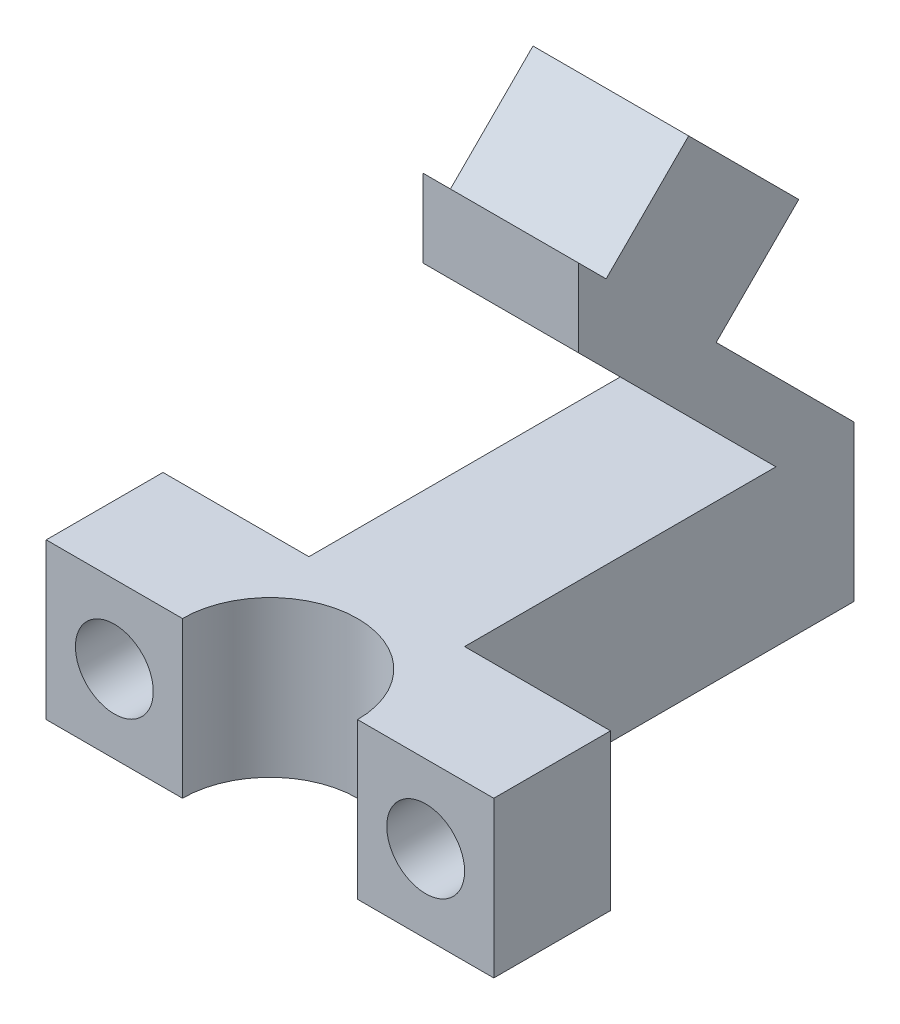
ISO-10303-21;
HEADER;
FILE_DESCRIPTION(('STEP AP214'),'2;1');
FILE_NAME('part.step','',(''),(''),'','','');
FILE_SCHEMA(('AUTOMOTIVE_DESIGN { 1 0 10303 214 1 1 1 1 }'));
ENDSEC;
DATA;
#1=APPLICATION_CONTEXT('core data for automotive mechanical design processes');
#2=APPLICATION_PROTOCOL_DEFINITION('international standard','automotive_design',2000,#1);
#3=PRODUCT_CONTEXT('',#1,'mechanical');
#4=PRODUCT('Part','Part','',(#3));
#5=PRODUCT_RELATED_PRODUCT_CATEGORY('part','',(#4));
#6=PRODUCT_DEFINITION_FORMATION('','',#4);
#7=PRODUCT_DEFINITION_CONTEXT('part definition',#1,'design');
#8=PRODUCT_DEFINITION('design','',#6,#7);
#9=PRODUCT_DEFINITION_SHAPE('','',#8);
#10=(LENGTH_UNIT() NAMED_UNIT(*) SI_UNIT(.MILLI.,.METRE.));
#11=(NAMED_UNIT(*) PLANE_ANGLE_UNIT() SI_UNIT($,.RADIAN.));
#12=(NAMED_UNIT(*) SI_UNIT($,.STERADIAN.) SOLID_ANGLE_UNIT());
#13=UNCERTAINTY_MEASURE_WITH_UNIT(LENGTH_MEASURE(1.E-05),#10,'distance_accuracy_value','');
#14=(GEOMETRIC_REPRESENTATION_CONTEXT(3) GLOBAL_UNCERTAINTY_ASSIGNED_CONTEXT((#13)) GLOBAL_UNIT_ASSIGNED_CONTEXT((#10,
#11,#12)) REPRESENTATION_CONTEXT('',''));
#15=CARTESIAN_POINT('',(0.,0.,0.));
#16=DIRECTION('',(0.,0.,1.));
#17=DIRECTION('',(1.,0.,0.));
#18=AXIS2_PLACEMENT_3D('',#15,#16,#17);
#19=CARTESIAN_POINT('',(-82.1296296296296,43.5052910052911,-100.));
#20=DIRECTION('',(0.,-0.707106781186551,0.707106781186544));
#21=DIRECTION('',(0.,-0.707106781186544,-0.707106781186551));
#22=AXIS2_PLACEMENT_3D('',#19,#20,#21);
#23=PLANE('',#22);
#24=DIRECTION('',(-1.,0.,0.));
#25=VECTOR('',#24,1.);
#26=CARTESIAN_POINT('',(17.8703703703704,78.8606300646182,-64.6446609406725));
#27=LINE('',#26,#25);
#28=CARTESIAN_POINT('',(17.8703703703704,78.8606300646182,-64.6446609406724));
#29=VERTEX_POINT('',#28);
#30=CARTESIAN_POINT('',(-22.1296296296296,78.8606300646182,-64.6446609406725));
#31=VERTEX_POINT('',#30);
#32=EDGE_CURVE('E320',#29,#31,#27,.T.);
#33=ORIENTED_EDGE('',*,*,#32,.F.);
#34=DIRECTION('',(0.,-0.707106781186544,-0.707106781186551));
#35=VECTOR('',#34,1.);
#36=CARTESIAN_POINT('',(17.8703703703704,43.505291005291,-100.));
#37=LINE('',#36,#35);
#38=CARTESIAN_POINT('',(17.8703703703704,43.505291005291,-100.));
#39=VERTEX_POINT('',#38);
#40=EDGE_CURVE('E182',#29,#39,#37,.T.);
#41=ORIENTED_EDGE('',*,*,#40,.T.);
#42=DIRECTION('',(1.,0.,0.));
#43=VECTOR('',#42,1.);
#44=CARTESIAN_POINT('',(-82.1296296296296,43.5052910052911,-100.));
#45=LINE('',#44,#43);
#46=CARTESIAN_POINT('',(-22.1296296296296,43.505291005291,-100.));
#47=VERTEX_POINT('',#46);
#48=EDGE_CURVE('E200',#47,#39,#45,.T.);
#49=ORIENTED_EDGE('',*,*,#48,.F.);
#50=DIRECTION('',(0.,-0.707106781186544,-0.707106781186551));
#51=VECTOR('',#50,1.);
#52=CARTESIAN_POINT('',(-22.1296296296296,43.505291005291,-100.));
#53=LINE('',#52,#51);
#54=EDGE_CURVE('E55',#31,#47,#53,.T.);
#55=ORIENTED_EDGE('',*,*,#54,.F.);
#56=EDGE_LOOP('',(#33,#41,#49,#55));
#57=FACE_BOUND('',#56,.T.);
#58=ADVANCED_FACE('F40',(#57),#23,.F.);
#59=DIRECTION('',(1.,0.,0.));
#60=VECTOR('',#59,1.);
#61=CARTESIAN_POINT('',(17.8703703703704,107.14490131208,-36.3603896932104));
#62=LINE('',#61,#60);
#63=CARTESIAN_POINT('',(-22.1296296296296,107.14490131208,-36.3603896932104));
#64=VERTEX_POINT('',#63);
#65=CARTESIAN_POINT('',(17.8703703703704,107.14490131208,-36.3603896932104));
#66=VERTEX_POINT('',#65);
#67=EDGE_CURVE('E63',#64,#66,#62,.T.);
#68=ORIENTED_EDGE('',*,*,#67,.F.);
#69=CARTESIAN_POINT('',(-22.1296296296296,114.215969123945,-29.2893218813449));
#70=VERTEX_POINT('',#69);
#71=EDGE_CURVE('E211',#70,#64,#53,.T.);
#72=ORIENTED_EDGE('',*,*,#71,.F.);
#73=DIRECTION('',(1.,0.,0.));
#74=VECTOR('',#73,1.);
#75=CARTESIAN_POINT('',(-82.1296296296296,114.215969123945,-29.2893218813449));
#76=LINE('',#75,#74);
#77=CARTESIAN_POINT('',(17.8703703703704,114.215969123945,-29.2893218813449));
#78=VERTEX_POINT('',#77);
#79=EDGE_CURVE('E204',#70,#78,#76,.T.);
#80=ORIENTED_EDGE('',*,*,#79,.T.);
#81=EDGE_CURVE('E197',#78,#66,#37,.T.);
#82=ORIENTED_EDGE('',*,*,#81,.T.);
#83=EDGE_LOOP('',(#68,#72,#80,#82));
#84=FACE_BOUND('',#83,.T.);
#85=ADVANCED_FACE('F311',(#84),#23,.F.);
#86=CARTESIAN_POINT('',(-59.6296296296296,43.505291005291,60.));
#87=DIRECTION('',(0.,-1.,0.));
#88=DIRECTION('',(0.,0.,-1.));
#89=AXIS2_PLACEMENT_3D('',#86,#87,#88);
#90=PLANE('',#89);
#91=DIRECTION('',(-1.,0.,0.));
#92=VECTOR('',#91,1.);
#93=CARTESIAN_POINT('',(-59.6296296296296,43.505291005291,0.));
#94=LINE('',#93,#92);
#95=CARTESIAN_POINT('',(55.3703703703704,43.505291005291,0.));
#96=VERTEX_POINT('',#95);
#97=CARTESIAN_POINT('',(17.8703703703704,43.505291005291,0.));
#98=VERTEX_POINT('',#97);
#99=EDGE_CURVE('E281',#96,#98,#94,.T.);
#100=ORIENTED_EDGE('',*,*,#99,.T.);
#101=DIRECTION('',(0.,0.,-1.));
#102=VECTOR('',#101,1.);
#103=CARTESIAN_POINT('',(17.8703703703704,43.505291005291,-79.9999999999998));
#104=LINE('',#103,#102);
#105=CARTESIAN_POINT('',(17.8703703703704,43.505291005291,-79.9999999999998));
#106=VERTEX_POINT('',#105);
#107=EDGE_CURVE('E183',#98,#106,#104,.T.);
#108=ORIENTED_EDGE('',*,*,#107,.T.);
#109=DIRECTION('',(1.,0.,0.));
#110=VECTOR('',#109,1.);
#111=CARTESIAN_POINT('',(-82.1296296296296,43.5052910052911,-79.9999999999998));
#112=LINE('',#111,#110);
#113=CARTESIAN_POINT('',(-22.1296296296296,43.505291005291,-79.9999999999998));
#114=VERTEX_POINT('',#113);
#115=EDGE_CURVE('E199',#114,#106,#112,.T.);
#116=ORIENTED_EDGE('',*,*,#115,.F.);
#117=DIRECTION('',(0.,0.,-1.));
#118=VECTOR('',#117,1.);
#119=CARTESIAN_POINT('',(-22.1296296296296,43.505291005291,-100.));
#120=LINE('',#119,#118);
#121=CARTESIAN_POINT('',(-22.1296296296296,43.505291005291,0.));
#122=VERTEX_POINT('',#121);
#123=EDGE_CURVE('E203',#122,#114,#120,.T.);
#124=ORIENTED_EDGE('',*,*,#123,.F.);
#125=CARTESIAN_POINT('',(-59.6296296296296,43.505291005291,0.));
#126=VERTEX_POINT('',#125);
#127=EDGE_CURVE('E280',#122,#126,#94,.T.);
#128=ORIENTED_EDGE('',*,*,#127,.T.);
#129=DIRECTION('',(0.,0.,-1.));
#130=VECTOR('',#129,1.);
#131=CARTESIAN_POINT('',(-59.6296296296296,43.505291005291,60.));
#132=LINE('',#131,#130);
#133=CARTESIAN_POINT('',(-59.6296296296296,43.505291005291,30.));
#134=VERTEX_POINT('',#133);
#135=EDGE_CURVE('E284',#134,#126,#132,.T.);
#136=ORIENTED_EDGE('',*,*,#135,.F.);
#137=DIRECTION('',(-1.,0.,0.));
#138=VECTOR('',#137,1.);
#139=CARTESIAN_POINT('',(-59.6296296296296,43.505291005291,30.));
#140=LINE('',#139,#138);
#141=CARTESIAN_POINT('',(-24.6296296296296,43.505291005291,30.));
#142=VERTEX_POINT('',#141);
#143=EDGE_CURVE('E250',#142,#134,#140,.T.);
#144=ORIENTED_EDGE('',*,*,#143,.F.);
#145=CARTESIAN_POINT('',(-2.12962962962962,43.505291005291,30.));
#146=DIRECTION('',(0.,1.,0.));
#147=DIRECTION('',(0.,0.,1.));
#148=AXIS2_PLACEMENT_3D('',#145,#146,#147);
#149=CIRCLE('',#148,22.5);
#150=CARTESIAN_POINT('',(20.3703703703704,43.505291005291,30.));
#151=VERTEX_POINT('',#150);
#152=EDGE_CURVE('E247',#151,#142,#149,.T.);
#153=ORIENTED_EDGE('',*,*,#152,.F.);
#154=DIRECTION('',(-1.,0.,0.));
#155=VECTOR('',#154,1.);
#156=CARTESIAN_POINT('',(20.3703703703704,43.505291005291,30.));
#157=LINE('',#156,#155);
#158=CARTESIAN_POINT('',(55.3703703703704,43.505291005291,30.));
#159=VERTEX_POINT('',#158);
#160=EDGE_CURVE('E244',#159,#151,#157,.T.);
#161=ORIENTED_EDGE('',*,*,#160,.F.);
#162=DIRECTION('',(0.,0.,-1.));
#163=VECTOR('',#162,1.);
#164=CARTESIAN_POINT('',(55.3703703703704,43.505291005291,60.));
#165=LINE('',#164,#163);
#166=EDGE_CURVE('E287',#159,#96,#165,.T.);
#167=ORIENTED_EDGE('',*,*,#166,.T.);
#168=EDGE_LOOP('',(#100,#108,#116,#124,#128,#136,#144,#153,#161,#167));
#169=FACE_BOUND('',#168,.T.);
#170=ADVANCED_FACE('F301',(#169),#90,.F.);
#171=CARTESIAN_POINT('',(0.,0.,0.));
#172=DIRECTION('',(0.,0.,1.));
#173=DIRECTION('',(1.,0.,0.));
#174=AXIS2_PLACEMENT_3D('',#171,#172,#173);
#175=PLANE('',#174);
#176=CARTESIAN_POINT('',(37.8703703703704,23.505291005291,0.));
#177=DIRECTION('',(0.,0.,1.));
#178=DIRECTION('',(1.,0.,0.));
#179=AXIS2_PLACEMENT_3D('',#176,#177,#178);
#180=CIRCLE('',#179,10.);
#181=CARTESIAN_POINT('',(47.8703703703704,23.505291005291,0.));
#182=VERTEX_POINT('',#181);
#183=EDGE_CURVE('E236',#182,#182,#180,.T.);
#184=ORIENTED_EDGE('',*,*,#183,.T.);
#185=EDGE_LOOP('',(#184));
#186=FACE_BOUND('',#185,.T.);
#187=DIRECTION('',(0.,-1.,0.));
#188=VECTOR('',#187,1.);
#189=CARTESIAN_POINT('',(17.8703703703704,43.505291005291,0.));
#190=LINE('',#189,#188);
#191=CARTESIAN_POINT('',(17.8703703703704,3.50529100529105,0.));
#192=VERTEX_POINT('',#191);
#193=EDGE_CURVE('E213',#98,#192,#190,.T.);
#194=ORIENTED_EDGE('',*,*,#193,.F.);
#195=ORIENTED_EDGE('',*,*,#99,.F.);
#196=DIRECTION('',(0.,1.,0.));
#197=VECTOR('',#196,1.);
#198=CARTESIAN_POINT('',(55.3703703703704,43.505291005291,0.));
#199=LINE('',#198,#197);
#200=CARTESIAN_POINT('',(55.3703703703704,3.50529100529105,0.));
#201=VERTEX_POINT('',#200);
#202=EDGE_CURVE('E277',#201,#96,#199,.T.);
#203=ORIENTED_EDGE('',*,*,#202,.F.);
#204=DIRECTION('',(1.,0.,0.));
#205=VECTOR('',#204,1.);
#206=CARTESIAN_POINT('',(-59.6296296296296,3.50529100529105,0.));
#207=LINE('',#206,#205);
#208=EDGE_CURVE('E273',#192,#201,#207,.T.);
#209=ORIENTED_EDGE('',*,*,#208,.F.);
#210=EDGE_LOOP('',(#194,#195,#203,#209));
#211=FACE_BOUND('',#210,.T.);
#212=ADVANCED_FACE('F356',(#186,#211),#175,.F.);
#213=CARTESIAN_POINT('',(-42.1296296296296,23.505291005291,0.));
#214=DIRECTION('',(0.,0.,1.));
#215=DIRECTION('',(1.,0.,0.));
#216=AXIS2_PLACEMENT_3D('',#213,#214,#215);
#217=CIRCLE('',#216,10.);
#218=CARTESIAN_POINT('',(-32.1296296296296,23.505291005291,0.));
#219=VERTEX_POINT('',#218);
#220=EDGE_CURVE('E241',#219,#219,#217,.T.);
#221=ORIENTED_EDGE('',*,*,#220,.T.);
#222=EDGE_LOOP('',(#221));
#223=FACE_BOUND('',#222,.T.);
#224=DIRECTION('',(0.,1.,0.));
#225=VECTOR('',#224,1.);
#226=CARTESIAN_POINT('',(-22.1296296296296,43.505291005291,0.));
#227=LINE('',#226,#225);
#228=CARTESIAN_POINT('',(-22.1296296296296,3.50529100529105,0.));
#229=VERTEX_POINT('',#228);
#230=EDGE_CURVE('E217',#229,#122,#227,.T.);
#231=ORIENTED_EDGE('',*,*,#230,.F.);
#232=CARTESIAN_POINT('',(-59.6296296296296,3.50529100529105,0.));
#233=VERTEX_POINT('',#232);
#234=EDGE_CURVE('E274',#233,#229,#207,.T.);
#235=ORIENTED_EDGE('',*,*,#234,.F.);
#236=DIRECTION('',(0.,-1.,0.));
#237=VECTOR('',#236,1.);
#238=CARTESIAN_POINT('',(-59.6296296296296,43.505291005291,0.));
#239=LINE('',#238,#237);
#240=EDGE_CURVE('E270',#126,#233,#239,.T.);
#241=ORIENTED_EDGE('',*,*,#240,.F.);
#242=ORIENTED_EDGE('',*,*,#127,.F.);
#243=EDGE_LOOP('',(#231,#235,#241,#242));
#244=FACE_BOUND('',#243,.T.);
#245=ADVANCED_FACE('F333',(#223,#244),#175,.F.);
#246=CARTESIAN_POINT('',(-59.6296296296296,43.505291005291,60.));
#247=DIRECTION('',(1.,0.,0.));
#248=DIRECTION('',(0.,0.,-1.));
#249=AXIS2_PLACEMENT_3D('',#246,#247,#248);
#250=PLANE('',#249);
#251=DIRECTION('',(0.,0.,-1.));
#252=VECTOR('',#251,1.);
#253=CARTESIAN_POINT('',(-59.6296296296296,3.50529100529105,60.));
#254=LINE('',#253,#252);
#255=CARTESIAN_POINT('',(-59.6296296296296,3.50529100529105,30.));
#256=VERTEX_POINT('',#255);
#257=EDGE_CURVE('E292',#256,#233,#254,.T.);
#258=ORIENTED_EDGE('',*,*,#257,.F.);
#259=DIRECTION('',(0.,1.,0.));
#260=VECTOR('',#259,1.);
#261=CARTESIAN_POINT('',(-59.6296296296296,-16.494708994709,30.));
#262=LINE('',#261,#260);
#263=EDGE_CURVE('E253',#256,#134,#262,.T.);
#264=ORIENTED_EDGE('',*,*,#263,.T.);
#265=ORIENTED_EDGE('',*,*,#135,.T.);
#266=ORIENTED_EDGE('',*,*,#240,.T.);
#267=EDGE_LOOP('',(#258,#264,#265,#266));
#268=FACE_BOUND('',#267,.T.);
#269=ADVANCED_FACE('F42',(#268),#250,.F.);
#270=CARTESIAN_POINT('',(-59.6296296296296,3.50529100529105,60.));
#271=DIRECTION('',(0.,1.,0.));
#272=DIRECTION('',(0.,0.,1.));
#273=AXIS2_PLACEMENT_3D('',#270,#271,#272);
#274=PLANE('',#273);
#275=CARTESIAN_POINT('',(-2.12962962962962,3.50529100529105,30.));
#276=DIRECTION('',(0.,1.,0.));
#277=DIRECTION('',(0.,0.,1.));
#278=AXIS2_PLACEMENT_3D('',#275,#276,#277);
#279=CIRCLE('',#278,22.5);
#280=CARTESIAN_POINT('',(20.3703703703704,3.50529100529105,30.));
#281=VERTEX_POINT('',#280);
#282=CARTESIAN_POINT('',(-24.6296296296296,3.50529100529105,30.));
#283=VERTEX_POINT('',#282);
#284=EDGE_CURVE('E264',#281,#283,#279,.T.);
#285=ORIENTED_EDGE('',*,*,#284,.T.);
#286=DIRECTION('',(-1.,0.,0.));
#287=VECTOR('',#286,1.);
#288=CARTESIAN_POINT('',(-59.6296296296296,3.50529100529105,30.));
#289=LINE('',#288,#287);
#290=EDGE_CURVE('E267',#283,#256,#289,.T.);
#291=ORIENTED_EDGE('',*,*,#290,.T.);
#292=ORIENTED_EDGE('',*,*,#257,.T.);
#293=ORIENTED_EDGE('',*,*,#234,.T.);
#294=DIRECTION('',(0.,0.,1.));
#295=VECTOR('',#294,1.);
#296=CARTESIAN_POINT('',(-22.1296296296296,3.50529100529105,-100.));
#297=LINE('',#296,#295);
#298=CARTESIAN_POINT('',(-22.1296296296296,3.50529100529105,-100.));
#299=VERTEX_POINT('',#298);
#300=EDGE_CURVE('E222',#299,#229,#297,.T.);
#301=ORIENTED_EDGE('',*,*,#300,.F.);
#302=DIRECTION('',(-1.,0.,0.));
#303=VECTOR('',#302,1.);
#304=CARTESIAN_POINT('',(17.8703703703704,3.50529100529105,-100.));
#305=LINE('',#304,#303);
#306=CARTESIAN_POINT('',(17.8703703703704,3.50529100529105,-100.));
#307=VERTEX_POINT('',#306);
#308=EDGE_CURVE('E216',#307,#299,#305,.T.);
#309=ORIENTED_EDGE('',*,*,#308,.F.);
#310=DIRECTION('',(0.,0.,1.));
#311=VECTOR('',#310,1.);
#312=CARTESIAN_POINT('',(17.8703703703704,3.50529100529105,-100.));
#313=LINE('',#312,#311);
#314=EDGE_CURVE('E229',#307,#192,#313,.T.);
#315=ORIENTED_EDGE('',*,*,#314,.T.);
#316=ORIENTED_EDGE('',*,*,#208,.T.);
#317=DIRECTION('',(0.,0.,-1.));
#318=VECTOR('',#317,1.);
#319=CARTESIAN_POINT('',(55.3703703703704,3.50529100529105,60.));
#320=LINE('',#319,#318);
#321=CARTESIAN_POINT('',(55.3703703703704,3.50529100529105,30.));
#322=VERTEX_POINT('',#321);
#323=EDGE_CURVE('E289',#322,#201,#320,.T.);
#324=ORIENTED_EDGE('',*,*,#323,.F.);
#325=DIRECTION('',(-1.,0.,0.));
#326=VECTOR('',#325,1.);
#327=CARTESIAN_POINT('',(-59.6296296296296,3.50529100529105,30.));
#328=LINE('',#327,#326);
#329=EDGE_CURVE('E256',#322,#281,#328,.T.);
#330=ORIENTED_EDGE('',*,*,#329,.T.);
#331=EDGE_LOOP('',(#285,#291,#292,#293,#301,#309,#315,#316,#324,#330));
#332=FACE_BOUND('',#331,.T.);
#333=ADVANCED_FACE('F330',(#332),#274,.F.);
#334=CARTESIAN_POINT('',(55.3703703703704,43.505291005291,60.));
#335=DIRECTION('',(-1.,0.,0.));
#336=DIRECTION('',(0.,-1.,0.));
#337=AXIS2_PLACEMENT_3D('',#334,#335,#336);
#338=PLANE('',#337);
#339=ORIENTED_EDGE('',*,*,#166,.F.);
#340=DIRECTION('',(0.,1.,0.));
#341=VECTOR('',#340,1.);
#342=CARTESIAN_POINT('',(55.3703703703704,-16.494708994709,30.));
#343=LINE('',#342,#341);
#344=EDGE_CURVE('E252',#322,#159,#343,.T.);
#345=ORIENTED_EDGE('',*,*,#344,.F.);
#346=ORIENTED_EDGE('',*,*,#323,.T.);
#347=ORIENTED_EDGE('',*,*,#202,.T.);
#348=EDGE_LOOP('',(#339,#345,#346,#347));
#349=FACE_BOUND('',#348,.T.);
#350=ADVANCED_FACE('F353',(#349),#338,.F.);
#351=CARTESIAN_POINT('',(-59.6296296296296,-16.494708994709,30.));
#352=DIRECTION('',(0.,0.,-1.));
#353=DIRECTION('',(-1.,0.,0.));
#354=AXIS2_PLACEMENT_3D('',#351,#352,#353);
#355=PLANE('',#354);
#356=CARTESIAN_POINT('',(-42.1296296296296,23.505291005291,30.));
#357=DIRECTION('',(0.,0.,1.));
#358=DIRECTION('',(1.,0.,0.));
#359=AXIS2_PLACEMENT_3D('',#356,#357,#358);
#360=CIRCLE('',#359,10.);
#361=CARTESIAN_POINT('',(-32.1296296296296,23.505291005291,30.));
#362=VERTEX_POINT('',#361);
#363=EDGE_CURVE('E233',#362,#362,#360,.T.);
#364=ORIENTED_EDGE('',*,*,#363,.F.);
#365=EDGE_LOOP('',(#364));
#366=FACE_BOUND('',#365,.T.);
#367=DIRECTION('',(0.,1.,0.));
#368=VECTOR('',#367,1.);
#369=CARTESIAN_POINT('',(-24.6296296296296,-16.494708994709,30.));
#370=LINE('',#369,#368);
#371=EDGE_CURVE('E257',#283,#142,#370,.T.);
#372=ORIENTED_EDGE('',*,*,#371,.T.);
#373=ORIENTED_EDGE('',*,*,#143,.T.);
#374=ORIENTED_EDGE('',*,*,#263,.F.);
#375=ORIENTED_EDGE('',*,*,#290,.F.);
#376=EDGE_LOOP('',(#372,#373,#374,#375));
#377=FACE_BOUND('',#376,.T.);
#378=ADVANCED_FACE('F340',(#366,#377),#355,.F.);
#379=CARTESIAN_POINT('',(-2.12962962962962,-16.494708994709,30.));
#380=DIRECTION('',(0.,1.,0.));
#381=DIRECTION('',(0.,0.,1.));
#382=AXIS2_PLACEMENT_3D('',#379,#380,#381);
#383=CYLINDRICAL_SURFACE('',#382,22.5);
#384=DIRECTION('',(0.,1.,0.));
#385=VECTOR('',#384,1.);
#386=CARTESIAN_POINT('',(20.3703703703704,-16.494708994709,30.));
#387=LINE('',#386,#385);
#388=EDGE_CURVE('E259',#281,#151,#387,.T.);
#389=ORIENTED_EDGE('',*,*,#388,.T.);
#390=ORIENTED_EDGE('',*,*,#152,.T.);
#391=ORIENTED_EDGE('',*,*,#371,.F.);
#392=ORIENTED_EDGE('',*,*,#284,.F.);
#393=EDGE_LOOP('',(#389,#390,#391,#392));
#394=FACE_BOUND('',#393,.T.);
#395=ADVANCED_FACE('F345',(#394),#383,.F.);
#396=CARTESIAN_POINT('',(20.3703703703704,-16.494708994709,30.));
#397=DIRECTION('',(0.,0.,-1.));
#398=DIRECTION('',(-1.,0.,0.));
#399=AXIS2_PLACEMENT_3D('',#396,#397,#398);
#400=PLANE('',#399);
#401=CARTESIAN_POINT('',(37.8703703703704,23.505291005291,30.));
#402=DIRECTION('',(0.,0.,1.));
#403=DIRECTION('',(1.,0.,0.));
#404=AXIS2_PLACEMENT_3D('',#401,#402,#403);
#405=CIRCLE('',#404,10.);
#406=CARTESIAN_POINT('',(47.8703703703704,23.505291005291,30.));
#407=VERTEX_POINT('',#406);
#408=EDGE_CURVE('E232',#407,#407,#405,.T.);
#409=ORIENTED_EDGE('',*,*,#408,.F.);
#410=EDGE_LOOP('',(#409));
#411=FACE_BOUND('',#410,.T.);
#412=ORIENTED_EDGE('',*,*,#344,.T.);
#413=ORIENTED_EDGE('',*,*,#160,.T.);
#414=ORIENTED_EDGE('',*,*,#388,.F.);
#415=ORIENTED_EDGE('',*,*,#329,.F.);
#416=EDGE_LOOP('',(#412,#413,#414,#415));
#417=FACE_BOUND('',#416,.T.);
#418=ADVANCED_FACE('F347',(#411,#417),#400,.F.);
#419=CARTESIAN_POINT('',(37.8703703703704,23.505291005291,-30.));
#420=DIRECTION('',(0.,0.,1.));
#421=DIRECTION('',(1.,0.,0.));
#422=AXIS2_PLACEMENT_3D('',#419,#420,#421);
#423=CYLINDRICAL_SURFACE('',#422,10.);
#424=ORIENTED_EDGE('',*,*,#408,.T.);
#425=EDGE_LOOP('',(#424));
#426=FACE_BOUND('',#425,.T.);
#427=ORIENTED_EDGE('',*,*,#183,.F.);
#428=EDGE_LOOP('',(#427));
#429=FACE_BOUND('',#428,.T.);
#430=ADVANCED_FACE('F388',(#426,#429),#423,.F.);
#431=CARTESIAN_POINT('',(-42.1296296296296,23.505291005291,-30.));
#432=DIRECTION('',(0.,0.,1.));
#433=DIRECTION('',(1.,0.,0.));
#434=AXIS2_PLACEMENT_3D('',#431,#432,#433);
#435=CYLINDRICAL_SURFACE('',#434,10.);
#436=ORIENTED_EDGE('',*,*,#363,.T.);
#437=EDGE_LOOP('',(#436));
#438=FACE_BOUND('',#437,.T.);
#439=ORIENTED_EDGE('',*,*,#220,.F.);
#440=EDGE_LOOP('',(#439));
#441=FACE_BOUND('',#440,.T.);
#442=ADVANCED_FACE('F385',(#438,#441),#435,.F.);
#443=CARTESIAN_POINT('',(17.8703703703704,43.505291005291,-100.));
#444=DIRECTION('',(-1.,0.,0.));
#445=DIRECTION('',(0.,-1.,0.));
#446=AXIS2_PLACEMENT_3D('',#443,#444,#445);
#447=PLANE('',#446);
#448=DIRECTION('',(0.,-1.,0.));
#449=VECTOR('',#448,1.);
#450=CARTESIAN_POINT('',(17.8703703703704,43.505291005291,-100.));
#451=LINE('',#450,#449);
#452=EDGE_CURVE('E214',#39,#307,#451,.T.);
#453=ORIENTED_EDGE('',*,*,#452,.F.);
#454=ORIENTED_EDGE('',*,*,#40,.F.);
#455=DIRECTION('',(0.,-0.707106781186551,0.707106781186544));
#456=VECTOR('',#455,1.);
#457=CARTESIAN_POINT('',(17.8703703703704,100.073833500215,-85.8578643762688));
#458=LINE('',#457,#456);
#459=CARTESIAN_POINT('',(17.8703703703704,100.073833500215,-85.8578643762688));
#460=VERTEX_POINT('',#459);
#461=EDGE_CURVE('E163',#460,#29,#458,.T.);
#462=ORIENTED_EDGE('',*,*,#461,.F.);
#463=DIRECTION('',(0.,-0.707106781186544,-0.707106781186551));
#464=VECTOR('',#463,1.);
#465=CARTESIAN_POINT('',(17.8703703703704,128.358104747677,-57.5735931288067));
#466=LINE('',#465,#464);
#467=CARTESIAN_POINT('',(17.8703703703704,128.358104747677,-57.5735931288067));
#468=VERTEX_POINT('',#467);
#469=EDGE_CURVE('E169',#468,#460,#466,.T.);
#470=ORIENTED_EDGE('',*,*,#469,.F.);
#471=DIRECTION('',(0.,-0.707106781186551,0.707106781186544));
#472=VECTOR('',#471,1.);
#473=CARTESIAN_POINT('',(17.8703703703704,128.358104747677,-57.5735931288067));
#474=LINE('',#473,#472);
#475=EDGE_CURVE('E316',#468,#66,#474,.T.);
#476=ORIENTED_EDGE('',*,*,#475,.T.);
#477=ORIENTED_EDGE('',*,*,#81,.F.);
#478=DIRECTION('',(0.,1.,0.));
#479=VECTOR('',#478,1.);
#480=CARTESIAN_POINT('',(17.8703703703704,114.215969123945,-29.2893218813449));
#481=LINE('',#480,#479);
#482=CARTESIAN_POINT('',(17.8703703703704,94.2159691239454,-29.2893218813449));
#483=VERTEX_POINT('',#482);
#484=EDGE_CURVE('E194',#483,#78,#481,.T.);
#485=ORIENTED_EDGE('',*,*,#484,.F.);
#486=DIRECTION('',(0.,0.707106781186543,0.707106781186551));
#487=VECTOR('',#486,1.);
#488=CARTESIAN_POINT('',(17.8703703703704,94.2159691239454,-29.2893218813449));
#489=LINE('',#488,#487);
#490=EDGE_CURVE('E186',#106,#483,#489,.T.);
#491=ORIENTED_EDGE('',*,*,#490,.F.);
#492=ORIENTED_EDGE('',*,*,#107,.F.);
#493=ORIENTED_EDGE('',*,*,#193,.T.);
#494=ORIENTED_EDGE('',*,*,#314,.F.);
#495=EDGE_LOOP('',(#453,#454,#462,#470,#476,#477,#485,#491,#492,#493,#494));
#496=FACE_BOUND('',#495,.T.);
#497=ADVANCED_FACE('F181',(#496),#447,.F.);
#498=CARTESIAN_POINT('',(-22.1296296296296,43.505291005291,-100.));
#499=DIRECTION('',(1.,0.,0.));
#500=DIRECTION('',(0.,1.,0.));
#501=AXIS2_PLACEMENT_3D('',#498,#499,#500);
#502=PLANE('',#501);
#503=DIRECTION('',(0.,1.,0.));
#504=VECTOR('',#503,1.);
#505=CARTESIAN_POINT('',(-22.1296296296296,43.505291005291,-29.2893218813449));
#506=LINE('',#505,#504);
#507=CARTESIAN_POINT('',(-22.1296296296296,94.2159691239454,-29.2893218813449));
#508=VERTEX_POINT('',#507);
#509=EDGE_CURVE('E11',#508,#70,#506,.T.);
#510=ORIENTED_EDGE('',*,*,#509,.T.);
#511=ORIENTED_EDGE('',*,*,#71,.T.);
#512=DIRECTION('',(0.,-0.707106781186551,0.707106781186544));
#513=VECTOR('',#512,1.);
#514=CARTESIAN_POINT('',(-22.1296296296296,128.358104747677,-57.5735931288067));
#515=LINE('',#514,#513);
#516=CARTESIAN_POINT('',(-22.1296296296296,128.358104747677,-57.5735931288067));
#517=VERTEX_POINT('',#516);
#518=EDGE_CURVE('E188',#517,#64,#515,.T.);
#519=ORIENTED_EDGE('',*,*,#518,.F.);
#520=DIRECTION('',(0.,0.707106781186544,0.707106781186551));
#521=VECTOR('',#520,1.);
#522=CARTESIAN_POINT('',(-22.1296296296296,128.358104747677,-57.5735931288067));
#523=LINE('',#522,#521);
#524=CARTESIAN_POINT('',(-22.1296296296296,100.073833500215,-85.8578643762688));
#525=VERTEX_POINT('',#524);
#526=EDGE_CURVE('E168',#525,#517,#523,.T.);
#527=ORIENTED_EDGE('',*,*,#526,.F.);
#528=DIRECTION('',(0.,-0.707106781186551,0.707106781186544));
#529=VECTOR('',#528,1.);
#530=CARTESIAN_POINT('',(-22.1296296296296,100.073833500215,-85.8578643762688));
#531=LINE('',#530,#529);
#532=EDGE_CURVE('E165',#525,#31,#531,.T.);
#533=ORIENTED_EDGE('',*,*,#532,.T.);
#534=ORIENTED_EDGE('',*,*,#54,.T.);
#535=DIRECTION('',(0.,1.,0.));
#536=VECTOR('',#535,1.);
#537=CARTESIAN_POINT('',(-22.1296296296296,43.505291005291,-100.));
#538=LINE('',#537,#536);
#539=EDGE_CURVE('E219',#299,#47,#538,.T.);
#540=ORIENTED_EDGE('',*,*,#539,.F.);
#541=ORIENTED_EDGE('',*,*,#300,.T.);
#542=ORIENTED_EDGE('',*,*,#230,.T.);
#543=ORIENTED_EDGE('',*,*,#123,.T.);
#544=DIRECTION('',(0.,0.707106781186544,0.707106781186552));
#545=VECTOR('',#544,1.);
#546=CARTESIAN_POINT('',(-22.1296296296296,33.505291005291,-90.));
#547=LINE('',#546,#545);
#548=EDGE_CURVE('E48',#114,#508,#547,.T.);
#549=ORIENTED_EDGE('',*,*,#548,.T.);
#550=EDGE_LOOP('',(#510,#511,#519,#527,#533,#534,#540,#541,#542,#543,#549));
#551=FACE_BOUND('',#550,.T.);
#552=ADVANCED_FACE('F295',(#551),#502,.F.);
#553=CARTESIAN_POINT('',(0.,0.,-100.));
#554=DIRECTION('',(0.,0.,-1.));
#555=DIRECTION('',(-1.,0.,0.));
#556=AXIS2_PLACEMENT_3D('',#553,#554,#555);
#557=PLANE('',#556);
#558=ORIENTED_EDGE('',*,*,#48,.T.);
#559=ORIENTED_EDGE('',*,*,#452,.T.);
#560=ORIENTED_EDGE('',*,*,#308,.T.);
#561=ORIENTED_EDGE('',*,*,#539,.T.);
#562=EDGE_LOOP('',(#558,#559,#560,#561));
#563=FACE_BOUND('',#562,.T.);
#564=ADVANCED_FACE('F325',(#563),#557,.T.);
#565=CARTESIAN_POINT('',(-82.1296296296296,114.215969123945,-29.2893218813449));
#566=DIRECTION('',(0.,0.,-1.));
#567=DIRECTION('',(0.,1.,0.));
#568=AXIS2_PLACEMENT_3D('',#565,#566,#567);
#569=PLANE('',#568);
#570=DIRECTION('',(1.,0.,0.));
#571=VECTOR('',#570,1.);
#572=CARTESIAN_POINT('',(-82.1296296296296,94.2159691239454,-29.2893218813449));
#573=LINE('',#572,#571);
#574=EDGE_CURVE('E206',#508,#483,#573,.T.);
#575=ORIENTED_EDGE('',*,*,#574,.T.);
#576=ORIENTED_EDGE('',*,*,#484,.T.);
#577=ORIENTED_EDGE('',*,*,#79,.F.);
#578=ORIENTED_EDGE('',*,*,#509,.F.);
#579=EDGE_LOOP('',(#575,#576,#577,#578));
#580=FACE_BOUND('',#579,.T.);
#581=ADVANCED_FACE('F310',(#580),#569,.F.);
#582=CARTESIAN_POINT('',(-82.1296296296296,94.2159691239454,-29.2893218813449));
#583=DIRECTION('',(0.,0.707106781186551,-0.707106781186543));
#584=DIRECTION('',(0.,0.707106781186544,0.707106781186552));
#585=AXIS2_PLACEMENT_3D('',#582,#583,#584);
#586=PLANE('',#585);
#587=ORIENTED_EDGE('',*,*,#115,.T.);
#588=ORIENTED_EDGE('',*,*,#490,.T.);
#589=ORIENTED_EDGE('',*,*,#574,.F.);
#590=ORIENTED_EDGE('',*,*,#548,.F.);
#591=EDGE_LOOP('',(#587,#588,#589,#590));
#592=FACE_BOUND('',#591,.T.);
#593=ADVANCED_FACE('F299',(#592),#586,.F.);
#594=CARTESIAN_POINT('',(17.8703703703704,100.073833500215,-85.8578643762688));
#595=DIRECTION('',(0.,0.707106781186544,0.707106781186551));
#596=DIRECTION('',(0.,-0.707106781186551,0.707106781186544));
#597=AXIS2_PLACEMENT_3D('',#594,#595,#596);
#598=PLANE('',#597);
#599=ORIENTED_EDGE('',*,*,#32,.T.);
#600=ORIENTED_EDGE('',*,*,#532,.F.);
#601=DIRECTION('',(-1.,0.,0.));
#602=VECTOR('',#601,1.);
#603=CARTESIAN_POINT('',(17.8703703703704,100.073833500215,-85.8578643762688));
#604=LINE('',#603,#602);
#605=EDGE_CURVE('E159',#460,#525,#604,.T.);
#606=ORIENTED_EDGE('',*,*,#605,.F.);
#607=ORIENTED_EDGE('',*,*,#461,.T.);
#608=EDGE_LOOP('',(#599,#600,#606,#607));
#609=FACE_BOUND('',#608,.T.);
#610=ADVANCED_FACE('F161',(#609),#598,.F.);
#611=CARTESIAN_POINT('',(17.8703703703704,128.358104747677,-57.5735931288067));
#612=DIRECTION('',(0.,-0.707106781186544,-0.707106781186551));
#613=DIRECTION('',(0.,0.707106781186551,-0.707106781186544));
#614=AXIS2_PLACEMENT_3D('',#611,#612,#613);
#615=PLANE('',#614);
#616=ORIENTED_EDGE('',*,*,#67,.T.);
#617=ORIENTED_EDGE('',*,*,#475,.F.);
#618=DIRECTION('',(1.,0.,0.));
#619=VECTOR('',#618,1.);
#620=CARTESIAN_POINT('',(17.8703703703704,128.358104747677,-57.5735931288067));
#621=LINE('',#620,#619);
#622=EDGE_CURVE('E174',#517,#468,#621,.T.);
#623=ORIENTED_EDGE('',*,*,#622,.F.);
#624=ORIENTED_EDGE('',*,*,#518,.T.);
#625=EDGE_LOOP('',(#616,#617,#623,#624));
#626=FACE_BOUND('',#625,.T.);
#627=ADVANCED_FACE('F315',(#626),#615,.F.);
#628=CARTESIAN_POINT('',(0.,92.9658489382423,-92.9658489382413));
#629=DIRECTION('',(0.,0.707106781186551,-0.707106781186544));
#630=DIRECTION('',(0.,0.707106781186544,0.707106781186551));
#631=AXIS2_PLACEMENT_3D('',#628,#629,#630);
#632=PLANE('',#631);
#633=ORIENTED_EDGE('',*,*,#469,.T.);
#634=ORIENTED_EDGE('',*,*,#605,.T.);
#635=ORIENTED_EDGE('',*,*,#526,.T.);
#636=ORIENTED_EDGE('',*,*,#622,.T.);
#637=EDGE_LOOP('',(#633,#634,#635,#636));
#638=FACE_BOUND('',#637,.T.);
#639=ADVANCED_FACE('F172',(#638),#632,.T.);
#640=CLOSED_SHELL('',(#58,#85,#170,#212,#245,#269,#333,#350,#378,#395,#418,#430,#442,#497,#552,
#564,#581,#593,#610,#627,#639));
#641=MANIFOLD_SOLID_BREP('B2',#640);
#642=ADVANCED_BREP_SHAPE_REPRESENTATION('',(#18,#641),#14);
#643=SHAPE_DEFINITION_REPRESENTATION(#9,#642);
ENDSEC;
END-ISO-10303-21;
